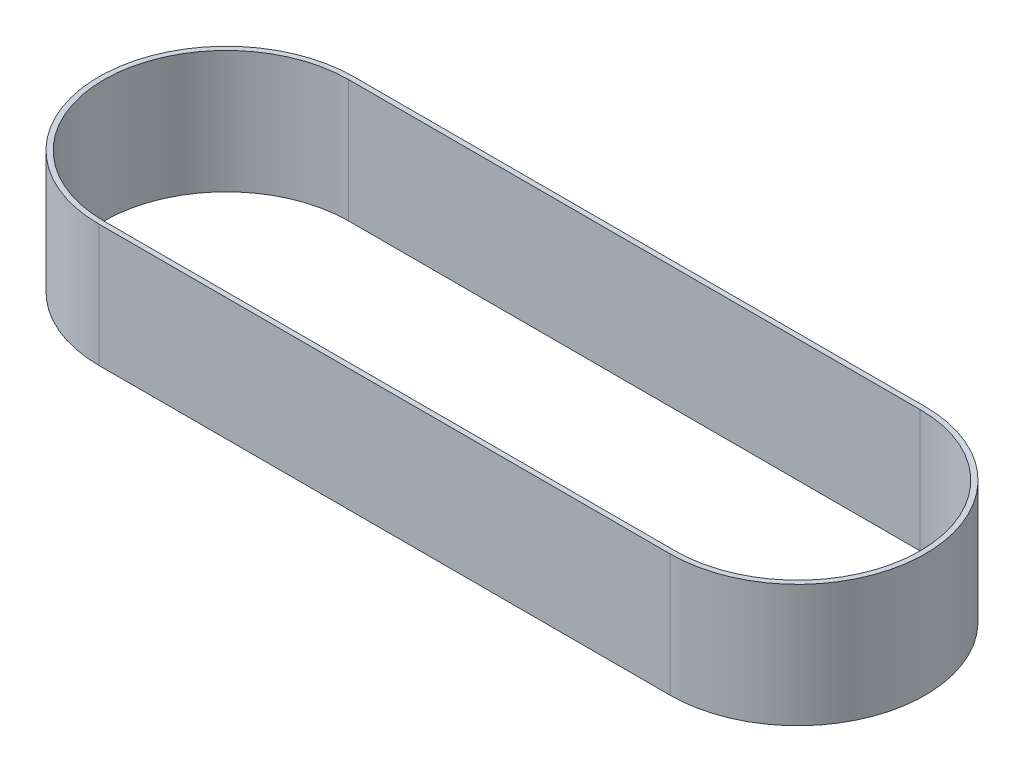
ISO-10303-21;
HEADER;
FILE_DESCRIPTION(('STEP AP214'),'2;1');
FILE_NAME('part.step','',(''),(''),'','','');
FILE_SCHEMA(('AUTOMOTIVE_DESIGN { 1 0 10303 214 1 1 1 1 }'));
ENDSEC;
DATA;
#1=APPLICATION_CONTEXT('core data for automotive mechanical design processes');
#2=APPLICATION_PROTOCOL_DEFINITION('international standard','automotive_design',2000,#1);
#3=PRODUCT_CONTEXT('',#1,'mechanical');
#4=PRODUCT('Part','Part','',(#3));
#5=PRODUCT_RELATED_PRODUCT_CATEGORY('part','',(#4));
#6=PRODUCT_DEFINITION_FORMATION('','',#4);
#7=PRODUCT_DEFINITION_CONTEXT('part definition',#1,'design');
#8=PRODUCT_DEFINITION('design','',#6,#7);
#9=PRODUCT_DEFINITION_SHAPE('','',#8);
#10=(LENGTH_UNIT() NAMED_UNIT(*) SI_UNIT(.MILLI.,.METRE.));
#11=(NAMED_UNIT(*) PLANE_ANGLE_UNIT() SI_UNIT($,.RADIAN.));
#12=(NAMED_UNIT(*) SI_UNIT($,.STERADIAN.) SOLID_ANGLE_UNIT());
#13=UNCERTAINTY_MEASURE_WITH_UNIT(LENGTH_MEASURE(1.E-05),#10,'distance_accuracy_value','');
#14=(GEOMETRIC_REPRESENTATION_CONTEXT(3) GLOBAL_UNCERTAINTY_ASSIGNED_CONTEXT((#13)) GLOBAL_UNIT_ASSIGNED_CONTEXT((#10,
#11,#12)) REPRESENTATION_CONTEXT('',''));
#15=CARTESIAN_POINT('',(0.,0.,0.));
#16=DIRECTION('',(0.,0.,1.));
#17=DIRECTION('',(1.,0.,0.));
#18=AXIS2_PLACEMENT_3D('',#15,#16,#17);
#19=CARTESIAN_POINT('',(-700.,300.,-312.5));
#20=DIRECTION('',(0.,0.,1.));
#21=DIRECTION('',(1.,0.,0.));
#22=AXIS2_PLACEMENT_3D('',#19,#20,#21);
#23=PLANE('',#22);
#24=DIRECTION('',(-1.,0.,0.));
#25=VECTOR('',#24,1.);
#26=CARTESIAN_POINT('',(-700.,0.,-312.5));
#27=LINE('',#26,#25);
#28=CARTESIAN_POINT('',(700.,0.,-312.5));
#29=VERTEX_POINT('',#28);
#30=CARTESIAN_POINT('',(-700.,0.,-312.5));
#31=VERTEX_POINT('',#30);
#32=EDGE_CURVE('E140',#29,#31,#27,.T.);
#33=ORIENTED_EDGE('',*,*,#32,.T.);
#34=DIRECTION('',(0.,-1.,0.));
#35=VECTOR('',#34,1.);
#36=CARTESIAN_POINT('',(-700.,300.,-312.5));
#37=LINE('',#36,#35);
#38=CARTESIAN_POINT('',(-700.,300.,-312.5));
#39=VERTEX_POINT('',#38);
#40=EDGE_CURVE('E40',#39,#31,#37,.T.);
#41=ORIENTED_EDGE('',*,*,#40,.F.);
#42=DIRECTION('',(-1.,0.,0.));
#43=VECTOR('',#42,1.);
#44=CARTESIAN_POINT('',(-700.,300.,-312.5));
#45=LINE('',#44,#43);
#46=CARTESIAN_POINT('',(700.,300.,-312.5));
#47=VERTEX_POINT('',#46);
#48=EDGE_CURVE('E141',#47,#39,#45,.T.);
#49=ORIENTED_EDGE('',*,*,#48,.F.);
#50=DIRECTION('',(0.,-1.,0.));
#51=VECTOR('',#50,1.);
#52=CARTESIAN_POINT('',(700.,300.,-312.5));
#53=LINE('',#52,#51);
#54=EDGE_CURVE('E11',#47,#29,#53,.T.);
#55=ORIENTED_EDGE('',*,*,#54,.T.);
#56=EDGE_LOOP('',(#33,#41,#49,#55));
#57=FACE_BOUND('',#56,.T.);
#58=ADVANCED_FACE('F33',(#57),#23,.F.);
#59=CARTESIAN_POINT('',(-700.,300.,312.5));
#60=DIRECTION('',(0.,0.,-1.));
#61=DIRECTION('',(-1.,0.,0.));
#62=AXIS2_PLACEMENT_3D('',#59,#60,#61);
#63=PLANE('',#62);
#64=DIRECTION('',(1.,0.,0.));
#65=VECTOR('',#64,1.);
#66=CARTESIAN_POINT('',(-700.,0.,312.5));
#67=LINE('',#66,#65);
#68=CARTESIAN_POINT('',(-700.,0.,312.5));
#69=VERTEX_POINT('',#68);
#70=CARTESIAN_POINT('',(700.,0.,312.5));
#71=VERTEX_POINT('',#70);
#72=EDGE_CURVE('E145',#69,#71,#67,.T.);
#73=ORIENTED_EDGE('',*,*,#72,.T.);
#74=DIRECTION('',(0.,-1.,0.));
#75=VECTOR('',#74,1.);
#76=CARTESIAN_POINT('',(700.,300.,312.5));
#77=LINE('',#76,#75);
#78=CARTESIAN_POINT('',(700.,300.,312.5));
#79=VERTEX_POINT('',#78);
#80=EDGE_CURVE('E147',#79,#71,#77,.T.);
#81=ORIENTED_EDGE('',*,*,#80,.F.);
#82=DIRECTION('',(1.,0.,0.));
#83=VECTOR('',#82,1.);
#84=CARTESIAN_POINT('',(-700.,300.,312.5));
#85=LINE('',#84,#83);
#86=CARTESIAN_POINT('',(-700.,300.,312.5));
#87=VERTEX_POINT('',#86);
#88=EDGE_CURVE('E144',#87,#79,#85,.T.);
#89=ORIENTED_EDGE('',*,*,#88,.F.);
#90=DIRECTION('',(0.,-1.,0.));
#91=VECTOR('',#90,1.);
#92=CARTESIAN_POINT('',(-700.,300.,312.5));
#93=LINE('',#92,#91);
#94=EDGE_CURVE('E153',#87,#69,#93,.T.);
#95=ORIENTED_EDGE('',*,*,#94,.T.);
#96=EDGE_LOOP('',(#73,#81,#89,#95));
#97=FACE_BOUND('',#96,.T.);
#98=ADVANCED_FACE('F172',(#97),#63,.F.);
#99=CARTESIAN_POINT('',(0.,300.,0.));
#100=DIRECTION('',(0.,-1.,0.));
#101=DIRECTION('',(0.,0.,-1.));
#102=AXIS2_PLACEMENT_3D('',#99,#100,#101);
#103=PLANE('',#102);
#104=CARTESIAN_POINT('',(700.,300.,0.));
#105=DIRECTION('',(0.,-1.,0.));
#106=DIRECTION('',(0.,0.,1.));
#107=AXIS2_PLACEMENT_3D('',#104,#105,#106);
#108=CIRCLE('',#107,300.);
#109=CARTESIAN_POINT('',(700.,300.,-300.));
#110=VERTEX_POINT('',#109);
#111=CARTESIAN_POINT('',(700.,300.,300.));
#112=VERTEX_POINT('',#111);
#113=EDGE_CURVE('E97',#110,#112,#108,.T.);
#114=ORIENTED_EDGE('',*,*,#113,.T.);
#115=DIRECTION('',(1.,0.,0.));
#116=VECTOR('',#115,1.);
#117=CARTESIAN_POINT('',(700.,300.,300.));
#118=LINE('',#117,#116);
#119=CARTESIAN_POINT('',(-700.,300.,300.));
#120=VERTEX_POINT('',#119);
#121=EDGE_CURVE('E111',#120,#112,#118,.T.);
#122=ORIENTED_EDGE('',*,*,#121,.F.);
#123=CARTESIAN_POINT('',(-700.,300.,0.));
#124=DIRECTION('',(0.,1.,0.));
#125=DIRECTION('',(0.,0.,1.));
#126=AXIS2_PLACEMENT_3D('',#123,#124,#125);
#127=CIRCLE('',#126,300.);
#128=CARTESIAN_POINT('',(-700.,300.,-300.));
#129=VERTEX_POINT('',#128);
#130=EDGE_CURVE('E47',#129,#120,#127,.T.);
#131=ORIENTED_EDGE('',*,*,#130,.F.);
#132=DIRECTION('',(-1.,0.,0.));
#133=VECTOR('',#132,1.);
#134=CARTESIAN_POINT('',(700.,300.,-300.));
#135=LINE('',#134,#133);
#136=EDGE_CURVE('E113',#110,#129,#135,.T.);
#137=ORIENTED_EDGE('',*,*,#136,.F.);
#138=EDGE_LOOP('',(#114,#122,#131,#137));
#139=FACE_BOUND('',#138,.T.);
#140=ORIENTED_EDGE('',*,*,#88,.T.);
#141=CARTESIAN_POINT('',(700.,300.,0.));
#142=DIRECTION('',(0.,-1.,0.));
#143=DIRECTION('',(0.,0.,-1.));
#144=AXIS2_PLACEMENT_3D('',#141,#142,#143);
#145=CIRCLE('',#144,312.5);
#146=EDGE_CURVE('E133',#79,#47,#145,.F.);
#147=ORIENTED_EDGE('',*,*,#146,.T.);
#148=ORIENTED_EDGE('',*,*,#48,.T.);
#149=CARTESIAN_POINT('',(-700.,300.,0.));
#150=DIRECTION('',(0.,-1.,0.));
#151=DIRECTION('',(0.,0.,-1.));
#152=AXIS2_PLACEMENT_3D('',#149,#150,#151);
#153=CIRCLE('',#152,312.5);
#154=EDGE_CURVE('E138',#87,#39,#153,.T.);
#155=ORIENTED_EDGE('',*,*,#154,.F.);
#156=EDGE_LOOP('',(#140,#147,#148,#155));
#157=FACE_BOUND('',#156,.T.);
#158=ADVANCED_FACE('F109',(#139,#157),#103,.F.);
#159=CARTESIAN_POINT('',(0.,0.,0.));
#160=DIRECTION('',(0.,-1.,0.));
#161=DIRECTION('',(0.,0.,-1.));
#162=AXIS2_PLACEMENT_3D('',#159,#160,#161);
#163=PLANE('',#162);
#164=DIRECTION('',(1.,0.,0.));
#165=VECTOR('',#164,1.);
#166=CARTESIAN_POINT('',(700.,0.,300.));
#167=LINE('',#166,#165);
#168=CARTESIAN_POINT('',(-700.,0.,300.));
#169=VERTEX_POINT('',#168);
#170=CARTESIAN_POINT('',(700.,0.,300.));
#171=VERTEX_POINT('',#170);
#172=EDGE_CURVE('E118',#169,#171,#167,.T.);
#173=ORIENTED_EDGE('',*,*,#172,.T.);
#174=CARTESIAN_POINT('',(700.,0.,0.));
#175=DIRECTION('',(0.,-1.,0.));
#176=DIRECTION('',(0.,0.,1.));
#177=AXIS2_PLACEMENT_3D('',#174,#175,#176);
#178=CIRCLE('',#177,300.);
#179=CARTESIAN_POINT('',(700.,0.,-300.));
#180=VERTEX_POINT('',#179);
#181=EDGE_CURVE('E55',#180,#171,#178,.T.);
#182=ORIENTED_EDGE('',*,*,#181,.F.);
#183=DIRECTION('',(-1.,0.,0.));
#184=VECTOR('',#183,1.);
#185=CARTESIAN_POINT('',(700.,0.,-300.));
#186=LINE('',#185,#184);
#187=CARTESIAN_POINT('',(-700.,0.,-300.));
#188=VERTEX_POINT('',#187);
#189=EDGE_CURVE('E123',#180,#188,#186,.T.);
#190=ORIENTED_EDGE('',*,*,#189,.T.);
#191=CARTESIAN_POINT('',(-700.,0.,0.));
#192=DIRECTION('',(0.,1.,0.));
#193=DIRECTION('',(0.,0.,1.));
#194=AXIS2_PLACEMENT_3D('',#191,#192,#193);
#195=CIRCLE('',#194,300.);
#196=EDGE_CURVE('E116',#188,#169,#195,.T.);
#197=ORIENTED_EDGE('',*,*,#196,.T.);
#198=EDGE_LOOP('',(#173,#182,#190,#197));
#199=FACE_BOUND('',#198,.T.);
#200=ORIENTED_EDGE('',*,*,#32,.F.);
#201=CARTESIAN_POINT('',(700.,0.,0.));
#202=DIRECTION('',(0.,-1.,0.));
#203=DIRECTION('',(0.,0.,1.));
#204=AXIS2_PLACEMENT_3D('',#201,#202,#203);
#205=CIRCLE('',#204,312.5);
#206=EDGE_CURVE('E128',#29,#71,#205,.T.);
#207=ORIENTED_EDGE('',*,*,#206,.T.);
#208=ORIENTED_EDGE('',*,*,#72,.F.);
#209=CARTESIAN_POINT('',(-700.,0.,0.));
#210=DIRECTION('',(0.,1.,0.));
#211=DIRECTION('',(0.,0.,1.));
#212=AXIS2_PLACEMENT_3D('',#209,#210,#211);
#213=CIRCLE('',#212,312.5);
#214=EDGE_CURVE('E136',#31,#69,#213,.T.);
#215=ORIENTED_EDGE('',*,*,#214,.F.);
#216=EDGE_LOOP('',(#200,#207,#208,#215));
#217=FACE_BOUND('',#216,.T.);
#218=ADVANCED_FACE('F163',(#199,#217),#163,.T.);
#219=CARTESIAN_POINT('',(-700.,1183.88347648318,0.));
#220=DIRECTION('',(0.,-1.,0.));
#221=DIRECTION('',(0.,0.,-1.));
#222=AXIS2_PLACEMENT_3D('',#219,#220,#221);
#223=CYLINDRICAL_SURFACE('',#222,312.5);
#224=ORIENTED_EDGE('',*,*,#154,.T.);
#225=ORIENTED_EDGE('',*,*,#40,.T.);
#226=ORIENTED_EDGE('',*,*,#214,.T.);
#227=ORIENTED_EDGE('',*,*,#94,.F.);
#228=EDGE_LOOP('',(#224,#225,#226,#227));
#229=FACE_BOUND('',#228,.T.);
#230=ADVANCED_FACE('F158',(#229),#223,.T.);
#231=CARTESIAN_POINT('',(700.,1183.88347648318,0.));
#232=DIRECTION('',(0.,-1.,0.));
#233=DIRECTION('',(0.,0.,-1.));
#234=AXIS2_PLACEMENT_3D('',#231,#232,#233);
#235=CYLINDRICAL_SURFACE('',#234,312.5);
#236=ORIENTED_EDGE('',*,*,#54,.F.);
#237=ORIENTED_EDGE('',*,*,#146,.F.);
#238=ORIENTED_EDGE('',*,*,#80,.T.);
#239=ORIENTED_EDGE('',*,*,#206,.F.);
#240=EDGE_LOOP('',(#236,#237,#238,#239));
#241=FACE_BOUND('',#240,.T.);
#242=ADVANCED_FACE('F168',(#241),#235,.T.);
#243=CARTESIAN_POINT('',(700.,0.,-300.));
#244=DIRECTION('',(0.,0.,-1.));
#245=DIRECTION('',(-1.,0.,0.));
#246=AXIS2_PLACEMENT_3D('',#243,#244,#245);
#247=PLANE('',#246);
#248=ORIENTED_EDGE('',*,*,#136,.T.);
#249=DIRECTION('',(0.,1.,0.));
#250=VECTOR('',#249,1.);
#251=CARTESIAN_POINT('',(-700.,0.,-300.));
#252=LINE('',#251,#250);
#253=EDGE_CURVE('E126',#188,#129,#252,.T.);
#254=ORIENTED_EDGE('',*,*,#253,.F.);
#255=ORIENTED_EDGE('',*,*,#189,.F.);
#256=DIRECTION('',(0.,1.,0.));
#257=VECTOR('',#256,1.);
#258=CARTESIAN_POINT('',(700.,0.,-300.));
#259=LINE('',#258,#257);
#260=EDGE_CURVE('E103',#180,#110,#259,.T.);
#261=ORIENTED_EDGE('',*,*,#260,.T.);
#262=EDGE_LOOP('',(#248,#254,#255,#261));
#263=FACE_BOUND('',#262,.T.);
#264=ADVANCED_FACE('F200',(#263),#247,.F.);
#265=CARTESIAN_POINT('',(700.,0.,300.));
#266=DIRECTION('',(0.,0.,1.));
#267=DIRECTION('',(1.,0.,0.));
#268=AXIS2_PLACEMENT_3D('',#265,#266,#267);
#269=PLANE('',#268);
#270=ORIENTED_EDGE('',*,*,#121,.T.);
#271=DIRECTION('',(0.,1.,0.));
#272=VECTOR('',#271,1.);
#273=CARTESIAN_POINT('',(700.,0.,300.));
#274=LINE('',#273,#272);
#275=EDGE_CURVE('E94',#171,#112,#274,.T.);
#276=ORIENTED_EDGE('',*,*,#275,.F.);
#277=ORIENTED_EDGE('',*,*,#172,.F.);
#278=DIRECTION('',(0.,1.,0.));
#279=VECTOR('',#278,1.);
#280=CARTESIAN_POINT('',(-700.,0.,300.));
#281=LINE('',#280,#279);
#282=EDGE_CURVE('E104',#169,#120,#281,.T.);
#283=ORIENTED_EDGE('',*,*,#282,.T.);
#284=EDGE_LOOP('',(#270,#276,#277,#283));
#285=FACE_BOUND('',#284,.T.);
#286=ADVANCED_FACE('F115',(#285),#269,.F.);
#287=CARTESIAN_POINT('',(-700.,0.,0.));
#288=DIRECTION('',(0.,1.,0.));
#289=DIRECTION('',(0.,0.,1.));
#290=AXIS2_PLACEMENT_3D('',#287,#288,#289);
#291=CYLINDRICAL_SURFACE('',#290,300.);
#292=ORIENTED_EDGE('',*,*,#253,.T.);
#293=ORIENTED_EDGE('',*,*,#130,.T.);
#294=ORIENTED_EDGE('',*,*,#282,.F.);
#295=ORIENTED_EDGE('',*,*,#196,.F.);
#296=EDGE_LOOP('',(#292,#293,#294,#295));
#297=FACE_BOUND('',#296,.T.);
#298=ADVANCED_FACE('F209',(#297),#291,.F.);
#299=CARTESIAN_POINT('',(700.,0.,0.));
#300=DIRECTION('',(0.,1.,0.));
#301=DIRECTION('',(0.,0.,1.));
#302=AXIS2_PLACEMENT_3D('',#299,#300,#301);
#303=CYLINDRICAL_SURFACE('',#302,300.);
#304=ORIENTED_EDGE('',*,*,#260,.F.);
#305=ORIENTED_EDGE('',*,*,#181,.T.);
#306=ORIENTED_EDGE('',*,*,#275,.T.);
#307=ORIENTED_EDGE('',*,*,#113,.F.);
#308=EDGE_LOOP('',(#304,#305,#306,#307));
#309=FACE_BOUND('',#308,.T.);
#310=ADVANCED_FACE('F96',(#309),#303,.F.);
#311=CLOSED_SHELL('',(#58,#98,#158,#218,#230,#242,#264,#286,#298,#310));
#312=MANIFOLD_SOLID_BREP('B2',#311);
#313=ADVANCED_BREP_SHAPE_REPRESENTATION('',(#18,#312),#14);
#314=SHAPE_DEFINITION_REPRESENTATION(#9,#313);
ENDSEC;
END-ISO-10303-21;
